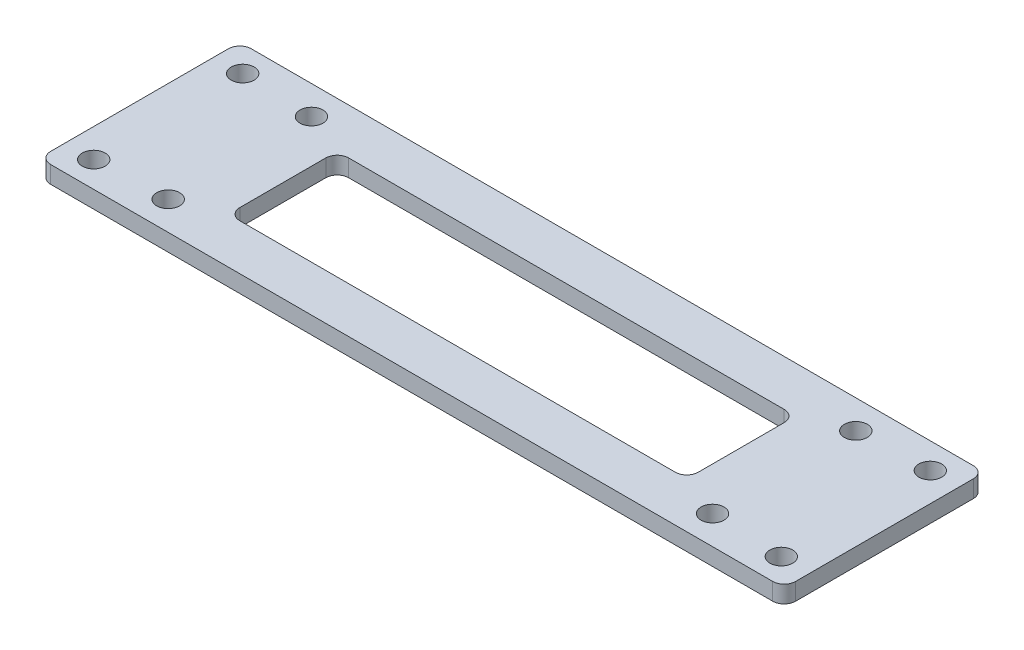
ISO-10303-21;
HEADER;
FILE_DESCRIPTION(('STEP AP214'),'2;1');
FILE_NAME('part.step','',(''),(''),'','','');
FILE_SCHEMA(('AUTOMOTIVE_DESIGN { 1 0 10303 214 1 1 1 1 }'));
ENDSEC;
DATA;
#1=APPLICATION_CONTEXT('core data for automotive mechanical design processes');
#2=APPLICATION_PROTOCOL_DEFINITION('international standard','automotive_design',2000,#1);
#3=PRODUCT_CONTEXT('',#1,'mechanical');
#4=PRODUCT('Part','Part','',(#3));
#5=PRODUCT_RELATED_PRODUCT_CATEGORY('part','',(#4));
#6=PRODUCT_DEFINITION_FORMATION('','',#4);
#7=PRODUCT_DEFINITION_CONTEXT('part definition',#1,'design');
#8=PRODUCT_DEFINITION('design','',#6,#7);
#9=PRODUCT_DEFINITION_SHAPE('','',#8);
#10=(LENGTH_UNIT() NAMED_UNIT(*) SI_UNIT(.MILLI.,.METRE.));
#11=(NAMED_UNIT(*) PLANE_ANGLE_UNIT() SI_UNIT($,.RADIAN.));
#12=(NAMED_UNIT(*) SI_UNIT($,.STERADIAN.) SOLID_ANGLE_UNIT());
#13=UNCERTAINTY_MEASURE_WITH_UNIT(LENGTH_MEASURE(1.E-05),#10,'distance_accuracy_value','');
#14=(GEOMETRIC_REPRESENTATION_CONTEXT(3) GLOBAL_UNCERTAINTY_ASSIGNED_CONTEXT((#13)) GLOBAL_UNIT_ASSIGNED_CONTEXT((#10,
#11,#12)) REPRESENTATION_CONTEXT('',''));
#15=CARTESIAN_POINT('',(0.,0.,0.));
#16=DIRECTION('',(0.,0.,1.));
#17=DIRECTION('',(1.,0.,0.));
#18=AXIS2_PLACEMENT_3D('',#15,#16,#17);
#19=CARTESIAN_POINT('',(0.,3.,0.));
#20=DIRECTION('',(0.,1.,0.));
#21=DIRECTION('',(0.,0.,1.));
#22=AXIS2_PLACEMENT_3D('',#19,#20,#21);
#23=PLANE('',#22);
#24=DIRECTION('',(0.,0.,-1.));
#25=VECTOR('',#24,1.);
#26=CARTESIAN_POINT('',(40.,3.,-9.5));
#27=LINE('',#26,#25);
#28=CARTESIAN_POINT('',(40.,3.,7.5));
#29=VERTEX_POINT('',#28);
#30=CARTESIAN_POINT('',(40.,3.,-7.5));
#31=VERTEX_POINT('',#30);
#32=EDGE_CURVE('E242',#29,#31,#27,.T.);
#33=ORIENTED_EDGE('',*,*,#32,.F.);
#34=CARTESIAN_POINT('',(38.,3.,7.5));
#35=DIRECTION('',(0.,1.,0.));
#36=DIRECTION('',(0.,0.,1.));
#37=AXIS2_PLACEMENT_3D('',#34,#35,#36);
#38=CIRCLE('',#37,2.);
#39=CARTESIAN_POINT('',(38.,3.,9.5));
#40=VERTEX_POINT('',#39);
#41=EDGE_CURVE('E222',#29,#40,#38,.F.);
#42=ORIENTED_EDGE('',*,*,#41,.T.);
#43=DIRECTION('',(1.,0.,0.));
#44=VECTOR('',#43,1.);
#45=CARTESIAN_POINT('',(-40.,3.,9.5));
#46=LINE('',#45,#44);
#47=CARTESIAN_POINT('',(-38.,3.,9.5));
#48=VERTEX_POINT('',#47);
#49=EDGE_CURVE('E266',#48,#40,#46,.T.);
#50=ORIENTED_EDGE('',*,*,#49,.F.);
#51=CARTESIAN_POINT('',(-38.,3.,7.5));
#52=DIRECTION('',(0.,1.,0.));
#53=DIRECTION('',(0.,0.,1.));
#54=AXIS2_PLACEMENT_3D('',#51,#52,#53);
#55=CIRCLE('',#54,2.);
#56=CARTESIAN_POINT('',(-40.,3.,7.5));
#57=VERTEX_POINT('',#56);
#58=EDGE_CURVE('E214',#48,#57,#55,.F.);
#59=ORIENTED_EDGE('',*,*,#58,.T.);
#60=DIRECTION('',(0.,0.,1.));
#61=VECTOR('',#60,1.);
#62=CARTESIAN_POINT('',(-40.,3.,-9.5));
#63=LINE('',#62,#61);
#64=CARTESIAN_POINT('',(-40.,3.,-7.5));
#65=VERTEX_POINT('',#64);
#66=EDGE_CURVE('E233',#65,#57,#63,.T.);
#67=ORIENTED_EDGE('',*,*,#66,.F.);
#68=CARTESIAN_POINT('',(-38.,3.,-7.5));
#69=DIRECTION('',(0.,1.,0.));
#70=DIRECTION('',(0.,0.,1.));
#71=AXIS2_PLACEMENT_3D('',#68,#69,#70);
#72=CIRCLE('',#71,2.);
#73=CARTESIAN_POINT('',(-38.,3.,-9.5));
#74=VERTEX_POINT('',#73);
#75=EDGE_CURVE('E43',#65,#74,#72,.F.);
#76=ORIENTED_EDGE('',*,*,#75,.T.);
#77=DIRECTION('',(-1.,0.,0.));
#78=VECTOR('',#77,1.);
#79=CARTESIAN_POINT('',(-40.,3.,-9.5));
#80=LINE('',#79,#78);
#81=CARTESIAN_POINT('',(38.,3.,-9.5));
#82=VERTEX_POINT('',#81);
#83=EDGE_CURVE('E231',#82,#74,#80,.T.);
#84=ORIENTED_EDGE('',*,*,#83,.F.);
#85=CARTESIAN_POINT('',(38.,3.,-7.5));
#86=DIRECTION('',(0.,1.,0.));
#87=DIRECTION('',(0.,0.,1.));
#88=AXIS2_PLACEMENT_3D('',#85,#86,#87);
#89=CIRCLE('',#88,2.);
#90=EDGE_CURVE('E218',#82,#31,#89,.F.);
#91=ORIENTED_EDGE('',*,*,#90,.T.);
#92=EDGE_LOOP('',(#33,#42,#50,#59,#67,#76,#84,#91));
#93=FACE_BOUND('',#92,.T.);
#94=CARTESIAN_POINT('',(47.5,3.,12.5));
#95=DIRECTION('',(0.,1.,0.));
#96=DIRECTION('',(0.,0.,-1.));
#97=AXIS2_PLACEMENT_3D('',#94,#95,#96);
#98=CIRCLE('',#97,2.);
#99=CARTESIAN_POINT('',(47.5,3.,10.5));
#100=VERTEX_POINT('',#99);
#101=EDGE_CURVE('E310',#100,#100,#98,.T.);
#102=ORIENTED_EDGE('',*,*,#101,.F.);
#103=EDGE_LOOP('',(#102));
#104=FACE_BOUND('',#103,.T.);
#105=CARTESIAN_POINT('',(-47.5,3.,-12.5));
#106=DIRECTION('',(0.,1.,0.));
#107=DIRECTION('',(0.,0.,1.));
#108=AXIS2_PLACEMENT_3D('',#105,#106,#107);
#109=CIRCLE('',#108,2.);
#110=CARTESIAN_POINT('',(-47.5,3.,-10.5));
#111=VERTEX_POINT('',#110);
#112=EDGE_CURVE('E171',#111,#111,#109,.T.);
#113=ORIENTED_EDGE('',*,*,#112,.F.);
#114=EDGE_LOOP('',(#113));
#115=FACE_BOUND('',#114,.T.);
#116=DIRECTION('',(-1.,0.,0.));
#117=VECTOR('',#116,1.);
#118=CARTESIAN_POINT('',(-55.,3.,-17.5));
#119=LINE('',#118,#117);
#120=CARTESIAN_POINT('',(63.,3.,-17.5));
#121=VERTEX_POINT('',#120);
#122=CARTESIAN_POINT('',(-63.,3.,-17.5));
#123=VERTEX_POINT('',#122);
#124=EDGE_CURVE('E157',#121,#123,#119,.T.);
#125=ORIENTED_EDGE('',*,*,#124,.T.);
#126=CARTESIAN_POINT('',(-63.,3.,-15.5));
#127=DIRECTION('',(0.,1.,0.));
#128=DIRECTION('',(0.,0.,1.));
#129=AXIS2_PLACEMENT_3D('',#126,#127,#128);
#130=CIRCLE('',#129,2.);
#131=CARTESIAN_POINT('',(-65.,3.,-15.5));
#132=VERTEX_POINT('',#131);
#133=EDGE_CURVE('E337',#123,#132,#130,.T.);
#134=ORIENTED_EDGE('',*,*,#133,.T.);
#135=DIRECTION('',(0.,0.,1.));
#136=VECTOR('',#135,1.);
#137=CARTESIAN_POINT('',(-65.,3.,17.5));
#138=LINE('',#137,#136);
#139=CARTESIAN_POINT('',(-65.,3.,15.5));
#140=VERTEX_POINT('',#139);
#141=EDGE_CURVE('E295',#132,#140,#138,.T.);
#142=ORIENTED_EDGE('',*,*,#141,.T.);
#143=CARTESIAN_POINT('',(-63.,3.,15.5));
#144=DIRECTION('',(0.,1.,0.));
#145=DIRECTION('',(0.,0.,1.));
#146=AXIS2_PLACEMENT_3D('',#143,#144,#145);
#147=CIRCLE('',#146,2.);
#148=CARTESIAN_POINT('',(-63.,3.,17.5));
#149=VERTEX_POINT('',#148);
#150=EDGE_CURVE('E335',#140,#149,#147,.T.);
#151=ORIENTED_EDGE('',*,*,#150,.T.);
#152=DIRECTION('',(1.,0.,0.));
#153=VECTOR('',#152,1.);
#154=CARTESIAN_POINT('',(-55.,3.,17.5));
#155=LINE('',#154,#153);
#156=CARTESIAN_POINT('',(63.,3.,17.5));
#157=VERTEX_POINT('',#156);
#158=EDGE_CURVE('E161',#149,#157,#155,.T.);
#159=ORIENTED_EDGE('',*,*,#158,.T.);
#160=CARTESIAN_POINT('',(63.,3.,15.5));
#161=DIRECTION('',(0.,1.,0.));
#162=DIRECTION('',(0.,0.,1.));
#163=AXIS2_PLACEMENT_3D('',#160,#161,#162);
#164=CIRCLE('',#163,2.);
#165=CARTESIAN_POINT('',(65.,3.,15.5));
#166=VERTEX_POINT('',#165);
#167=EDGE_CURVE('E333',#157,#166,#164,.T.);
#168=ORIENTED_EDGE('',*,*,#167,.T.);
#169=DIRECTION('',(0.,0.,-1.));
#170=VECTOR('',#169,1.);
#171=CARTESIAN_POINT('',(65.,3.,17.5));
#172=LINE('',#171,#170);
#173=CARTESIAN_POINT('',(65.,3.,-15.5));
#174=VERTEX_POINT('',#173);
#175=EDGE_CURVE('E278',#166,#174,#172,.T.);
#176=ORIENTED_EDGE('',*,*,#175,.T.);
#177=CARTESIAN_POINT('',(63.,3.,-15.5));
#178=DIRECTION('',(0.,1.,0.));
#179=DIRECTION('',(0.,0.,1.));
#180=AXIS2_PLACEMENT_3D('',#177,#178,#179);
#181=CIRCLE('',#180,2.);
#182=EDGE_CURVE('E331',#174,#121,#181,.T.);
#183=ORIENTED_EDGE('',*,*,#182,.T.);
#184=EDGE_LOOP('',(#125,#134,#142,#151,#159,#168,#176,#183));
#185=FACE_BOUND('',#184,.T.);
#186=CARTESIAN_POINT('',(-47.5,3.,12.5));
#187=DIRECTION('',(0.,1.,0.));
#188=DIRECTION('',(0.,0.,1.));
#189=AXIS2_PLACEMENT_3D('',#186,#187,#188);
#190=CIRCLE('',#189,2.);
#191=CARTESIAN_POINT('',(-47.5,3.,14.5));
#192=VERTEX_POINT('',#191);
#193=EDGE_CURVE('E316',#192,#192,#190,.T.);
#194=ORIENTED_EDGE('',*,*,#193,.F.);
#195=EDGE_LOOP('',(#194));
#196=FACE_BOUND('',#195,.T.);
#197=CARTESIAN_POINT('',(47.5,3.,-12.5));
#198=DIRECTION('',(0.,1.,0.));
#199=DIRECTION('',(0.,0.,-1.));
#200=AXIS2_PLACEMENT_3D('',#197,#198,#199);
#201=CIRCLE('',#200,2.);
#202=CARTESIAN_POINT('',(47.5,3.,-14.5));
#203=VERTEX_POINT('',#202);
#204=EDGE_CURVE('E304',#203,#203,#201,.T.);
#205=ORIENTED_EDGE('',*,*,#204,.F.);
#206=EDGE_LOOP('',(#205));
#207=FACE_BOUND('',#206,.T.);
#208=CARTESIAN_POINT('',(-59.9999999999997,3.,13.));
#209=DIRECTION('',(0.,1.,0.));
#210=DIRECTION('',(0.,0.,1.));
#211=AXIS2_PLACEMENT_3D('',#208,#209,#210);
#212=CIRCLE('',#211,2.);
#213=CARTESIAN_POINT('',(-59.9999999999997,3.,15.));
#214=VERTEX_POINT('',#213);
#215=EDGE_CURVE('E283',#214,#214,#212,.T.);
#216=ORIENTED_EDGE('',*,*,#215,.F.);
#217=EDGE_LOOP('',(#216));
#218=FACE_BOUND('',#217,.T.);
#219=CARTESIAN_POINT('',(-60.,3.,-13.));
#220=DIRECTION('',(0.,1.,0.));
#221=DIRECTION('',(0.,0.,1.));
#222=AXIS2_PLACEMENT_3D('',#219,#220,#221);
#223=CIRCLE('',#222,2.);
#224=CARTESIAN_POINT('',(-60.,3.,-11.));
#225=VERTEX_POINT('',#224);
#226=EDGE_CURVE('E289',#225,#225,#223,.T.);
#227=ORIENTED_EDGE('',*,*,#226,.F.);
#228=EDGE_LOOP('',(#227));
#229=FACE_BOUND('',#228,.T.);
#230=CARTESIAN_POINT('',(60.,3.,13.));
#231=DIRECTION('',(0.,1.,0.));
#232=DIRECTION('',(0.,0.,1.));
#233=AXIS2_PLACEMENT_3D('',#230,#231,#232);
#234=CIRCLE('',#233,2.);
#235=CARTESIAN_POINT('',(60.,3.,15.));
#236=VERTEX_POINT('',#235);
#237=EDGE_CURVE('E257',#236,#236,#234,.T.);
#238=ORIENTED_EDGE('',*,*,#237,.F.);
#239=EDGE_LOOP('',(#238));
#240=FACE_BOUND('',#239,.T.);
#241=CARTESIAN_POINT('',(60.,3.,-13.));
#242=DIRECTION('',(0.,1.,0.));
#243=DIRECTION('',(0.,0.,1.));
#244=AXIS2_PLACEMENT_3D('',#241,#242,#243);
#245=CIRCLE('',#244,2.);
#246=CARTESIAN_POINT('',(60.,3.,-11.));
#247=VERTEX_POINT('',#246);
#248=EDGE_CURVE('E272',#247,#247,#245,.T.);
#249=ORIENTED_EDGE('',*,*,#248,.F.);
#250=EDGE_LOOP('',(#249));
#251=FACE_BOUND('',#250,.T.);
#252=ADVANCED_FACE('F35',(#93,#104,#115,#185,#196,#207,#218,#229,#240,#251),#23,.T.);
#253=CARTESIAN_POINT('',(0.,0.,0.));
#254=DIRECTION('',(0.,1.,0.));
#255=DIRECTION('',(0.,0.,1.));
#256=AXIS2_PLACEMENT_3D('',#253,#254,#255);
#257=PLANE('',#256);
#258=DIRECTION('',(0.,0.,1.));
#259=VECTOR('',#258,1.);
#260=CARTESIAN_POINT('',(-40.,0.,-9.5));
#261=LINE('',#260,#259);
#262=CARTESIAN_POINT('',(-40.,0.,-7.5));
#263=VERTEX_POINT('',#262);
#264=CARTESIAN_POINT('',(-40.,0.,7.5));
#265=VERTEX_POINT('',#264);
#266=EDGE_CURVE('E248',#263,#265,#261,.T.);
#267=ORIENTED_EDGE('',*,*,#266,.T.);
#268=CARTESIAN_POINT('',(-38.,0.,7.5));
#269=DIRECTION('',(0.,1.,0.));
#270=DIRECTION('',(0.,0.,1.));
#271=AXIS2_PLACEMENT_3D('',#268,#269,#270);
#272=CIRCLE('',#271,2.);
#273=CARTESIAN_POINT('',(-38.,0.,9.5));
#274=VERTEX_POINT('',#273);
#275=EDGE_CURVE('E216',#265,#274,#272,.T.);
#276=ORIENTED_EDGE('',*,*,#275,.T.);
#277=DIRECTION('',(1.,0.,0.));
#278=VECTOR('',#277,1.);
#279=CARTESIAN_POINT('',(-40.,0.,9.5));
#280=LINE('',#279,#278);
#281=CARTESIAN_POINT('',(38.,0.,9.5));
#282=VERTEX_POINT('',#281);
#283=EDGE_CURVE('E254',#274,#282,#280,.T.);
#284=ORIENTED_EDGE('',*,*,#283,.T.);
#285=CARTESIAN_POINT('',(38.,0.,7.5));
#286=DIRECTION('',(0.,1.,0.));
#287=DIRECTION('',(0.,0.,1.));
#288=AXIS2_PLACEMENT_3D('',#285,#286,#287);
#289=CIRCLE('',#288,2.);
#290=CARTESIAN_POINT('',(40.,0.,7.5));
#291=VERTEX_POINT('',#290);
#292=EDGE_CURVE('E224',#282,#291,#289,.T.);
#293=ORIENTED_EDGE('',*,*,#292,.T.);
#294=DIRECTION('',(0.,0.,-1.));
#295=VECTOR('',#294,1.);
#296=CARTESIAN_POINT('',(40.,0.,-9.5));
#297=LINE('',#296,#295);
#298=CARTESIAN_POINT('',(40.,0.,-7.5));
#299=VERTEX_POINT('',#298);
#300=EDGE_CURVE('E259',#291,#299,#297,.T.);
#301=ORIENTED_EDGE('',*,*,#300,.T.);
#302=CARTESIAN_POINT('',(38.,0.,-7.5));
#303=DIRECTION('',(0.,1.,0.));
#304=DIRECTION('',(0.,0.,1.));
#305=AXIS2_PLACEMENT_3D('',#302,#303,#304);
#306=CIRCLE('',#305,2.);
#307=CARTESIAN_POINT('',(38.,0.,-9.5));
#308=VERTEX_POINT('',#307);
#309=EDGE_CURVE('E220',#299,#308,#306,.T.);
#310=ORIENTED_EDGE('',*,*,#309,.T.);
#311=DIRECTION('',(-1.,0.,0.));
#312=VECTOR('',#311,1.);
#313=CARTESIAN_POINT('',(-40.,0.,-9.5));
#314=LINE('',#313,#312);
#315=CARTESIAN_POINT('',(-38.,0.,-9.5));
#316=VERTEX_POINT('',#315);
#317=EDGE_CURVE('E250',#308,#316,#314,.T.);
#318=ORIENTED_EDGE('',*,*,#317,.T.);
#319=CARTESIAN_POINT('',(-38.,0.,-7.5));
#320=DIRECTION('',(0.,1.,0.));
#321=DIRECTION('',(0.,0.,1.));
#322=AXIS2_PLACEMENT_3D('',#319,#320,#321);
#323=CIRCLE('',#322,2.);
#324=EDGE_CURVE('E11',#316,#263,#323,.T.);
#325=ORIENTED_EDGE('',*,*,#324,.T.);
#326=EDGE_LOOP('',(#267,#276,#284,#293,#301,#310,#318,#325));
#327=FACE_BOUND('',#326,.T.);
#328=DIRECTION('',(0.,0.,1.));
#329=VECTOR('',#328,1.);
#330=CARTESIAN_POINT('',(-65.,0.,17.5));
#331=LINE('',#330,#329);
#332=CARTESIAN_POINT('',(-65.,0.,-15.5));
#333=VERTEX_POINT('',#332);
#334=CARTESIAN_POINT('',(-65.,0.,15.5));
#335=VERTEX_POINT('',#334);
#336=EDGE_CURVE('E298',#333,#335,#331,.T.);
#337=ORIENTED_EDGE('',*,*,#336,.F.);
#338=CARTESIAN_POINT('',(-63.,0.,-15.5));
#339=DIRECTION('',(0.,1.,0.));
#340=DIRECTION('',(0.,0.,1.));
#341=AXIS2_PLACEMENT_3D('',#338,#339,#340);
#342=CIRCLE('',#341,2.);
#343=CARTESIAN_POINT('',(-63.,0.,-17.5));
#344=VERTEX_POINT('',#343);
#345=EDGE_CURVE('E169',#333,#344,#342,.F.);
#346=ORIENTED_EDGE('',*,*,#345,.T.);
#347=DIRECTION('',(-1.,0.,0.));
#348=VECTOR('',#347,1.);
#349=CARTESIAN_POINT('',(-55.,0.,-17.5));
#350=LINE('',#349,#348);
#351=CARTESIAN_POINT('',(63.,0.,-17.5));
#352=VERTEX_POINT('',#351);
#353=EDGE_CURVE('E154',#352,#344,#350,.T.);
#354=ORIENTED_EDGE('',*,*,#353,.F.);
#355=CARTESIAN_POINT('',(63.,0.,-15.5));
#356=DIRECTION('',(0.,1.,0.));
#357=DIRECTION('',(0.,0.,1.));
#358=AXIS2_PLACEMENT_3D('',#355,#356,#357);
#359=CIRCLE('',#358,2.);
#360=CARTESIAN_POINT('',(65.,0.,-15.5));
#361=VERTEX_POINT('',#360);
#362=EDGE_CURVE('E166',#352,#361,#359,.F.);
#363=ORIENTED_EDGE('',*,*,#362,.T.);
#364=DIRECTION('',(0.,0.,-1.));
#365=VECTOR('',#364,1.);
#366=CARTESIAN_POINT('',(65.,0.,17.5));
#367=LINE('',#366,#365);
#368=CARTESIAN_POINT('',(65.,0.,15.5));
#369=VERTEX_POINT('',#368);
#370=EDGE_CURVE('E281',#369,#361,#367,.T.);
#371=ORIENTED_EDGE('',*,*,#370,.F.);
#372=CARTESIAN_POINT('',(63.,0.,15.5));
#373=DIRECTION('',(0.,1.,0.));
#374=DIRECTION('',(0.,0.,1.));
#375=AXIS2_PLACEMENT_3D('',#372,#373,#374);
#376=CIRCLE('',#375,2.);
#377=CARTESIAN_POINT('',(63.,0.,17.5));
#378=VERTEX_POINT('',#377);
#379=EDGE_CURVE('E50',#369,#378,#376,.F.);
#380=ORIENTED_EDGE('',*,*,#379,.T.);
#381=DIRECTION('',(1.,0.,0.));
#382=VECTOR('',#381,1.);
#383=CARTESIAN_POINT('',(-55.,0.,17.5));
#384=LINE('',#383,#382);
#385=CARTESIAN_POINT('',(-63.,0.,17.5));
#386=VERTEX_POINT('',#385);
#387=EDGE_CURVE('E170',#386,#378,#384,.T.);
#388=ORIENTED_EDGE('',*,*,#387,.F.);
#389=CARTESIAN_POINT('',(-63.,0.,15.5));
#390=DIRECTION('',(0.,1.,0.));
#391=DIRECTION('',(0.,0.,1.));
#392=AXIS2_PLACEMENT_3D('',#389,#390,#391);
#393=CIRCLE('',#392,2.);
#394=EDGE_CURVE('E179',#386,#335,#393,.F.);
#395=ORIENTED_EDGE('',*,*,#394,.T.);
#396=EDGE_LOOP('',(#337,#346,#354,#363,#371,#380,#388,#395));
#397=FACE_BOUND('',#396,.T.);
#398=CARTESIAN_POINT('',(-47.5,0.,-12.5));
#399=DIRECTION('',(0.,1.,0.));
#400=DIRECTION('',(0.,0.,1.));
#401=AXIS2_PLACEMENT_3D('',#398,#399,#400);
#402=CIRCLE('',#401,2.);
#403=CARTESIAN_POINT('',(-47.5,0.,-10.5));
#404=VERTEX_POINT('',#403);
#405=EDGE_CURVE('E319',#404,#404,#402,.T.);
#406=ORIENTED_EDGE('',*,*,#405,.T.);
#407=EDGE_LOOP('',(#406));
#408=FACE_BOUND('',#407,.T.);
#409=CARTESIAN_POINT('',(-47.5,0.,12.5));
#410=DIRECTION('',(0.,1.,0.));
#411=DIRECTION('',(0.,0.,1.));
#412=AXIS2_PLACEMENT_3D('',#409,#410,#411);
#413=CIRCLE('',#412,2.);
#414=CARTESIAN_POINT('',(-47.5,0.,14.5));
#415=VERTEX_POINT('',#414);
#416=EDGE_CURVE('E313',#415,#415,#413,.T.);
#417=ORIENTED_EDGE('',*,*,#416,.T.);
#418=EDGE_LOOP('',(#417));
#419=FACE_BOUND('',#418,.T.);
#420=CARTESIAN_POINT('',(47.5,0.,12.5));
#421=DIRECTION('',(0.,1.,0.));
#422=DIRECTION('',(0.,0.,-1.));
#423=AXIS2_PLACEMENT_3D('',#420,#421,#422);
#424=CIRCLE('',#423,2.);
#425=CARTESIAN_POINT('',(47.5,0.,10.5));
#426=VERTEX_POINT('',#425);
#427=EDGE_CURVE('E307',#426,#426,#424,.T.);
#428=ORIENTED_EDGE('',*,*,#427,.T.);
#429=EDGE_LOOP('',(#428));
#430=FACE_BOUND('',#429,.T.);
#431=CARTESIAN_POINT('',(47.5,0.,-12.5));
#432=DIRECTION('',(0.,1.,0.));
#433=DIRECTION('',(0.,0.,-1.));
#434=AXIS2_PLACEMENT_3D('',#431,#432,#433);
#435=CIRCLE('',#434,2.);
#436=CARTESIAN_POINT('',(47.5,0.,-14.5));
#437=VERTEX_POINT('',#436);
#438=EDGE_CURVE('E301',#437,#437,#435,.T.);
#439=ORIENTED_EDGE('',*,*,#438,.T.);
#440=EDGE_LOOP('',(#439));
#441=FACE_BOUND('',#440,.T.);
#442=CARTESIAN_POINT('',(-59.9999999999997,0.,13.));
#443=DIRECTION('',(0.,1.,0.));
#444=DIRECTION('',(0.,0.,1.));
#445=AXIS2_PLACEMENT_3D('',#442,#443,#444);
#446=CIRCLE('',#445,2.);
#447=CARTESIAN_POINT('',(-59.9999999999997,0.,15.));
#448=VERTEX_POINT('',#447);
#449=EDGE_CURVE('E286',#448,#448,#446,.T.);
#450=ORIENTED_EDGE('',*,*,#449,.T.);
#451=EDGE_LOOP('',(#450));
#452=FACE_BOUND('',#451,.T.);
#453=CARTESIAN_POINT('',(-60.,0.,-13.));
#454=DIRECTION('',(0.,1.,0.));
#455=DIRECTION('',(0.,0.,1.));
#456=AXIS2_PLACEMENT_3D('',#453,#454,#455);
#457=CIRCLE('',#456,2.);
#458=CARTESIAN_POINT('',(-60.,0.,-11.));
#459=VERTEX_POINT('',#458);
#460=EDGE_CURVE('E292',#459,#459,#457,.T.);
#461=ORIENTED_EDGE('',*,*,#460,.T.);
#462=EDGE_LOOP('',(#461));
#463=FACE_BOUND('',#462,.T.);
#464=CARTESIAN_POINT('',(60.,0.,13.));
#465=DIRECTION('',(0.,1.,0.));
#466=DIRECTION('',(0.,0.,1.));
#467=AXIS2_PLACEMENT_3D('',#464,#465,#466);
#468=CIRCLE('',#467,2.);
#469=CARTESIAN_POINT('',(60.,0.,15.));
#470=VERTEX_POINT('',#469);
#471=EDGE_CURVE('E269',#470,#470,#468,.T.);
#472=ORIENTED_EDGE('',*,*,#471,.T.);
#473=EDGE_LOOP('',(#472));
#474=FACE_BOUND('',#473,.T.);
#475=CARTESIAN_POINT('',(60.,0.,-13.));
#476=DIRECTION('',(0.,1.,0.));
#477=DIRECTION('',(0.,0.,1.));
#478=AXIS2_PLACEMENT_3D('',#475,#476,#477);
#479=CIRCLE('',#478,2.);
#480=CARTESIAN_POINT('',(60.,0.,-11.));
#481=VERTEX_POINT('',#480);
#482=EDGE_CURVE('E275',#481,#481,#479,.T.);
#483=ORIENTED_EDGE('',*,*,#482,.T.);
#484=EDGE_LOOP('',(#483));
#485=FACE_BOUND('',#484,.T.);
#486=ADVANCED_FACE('F164',(#327,#397,#408,#419,#430,#441,#452,#463,#474,#485),#257,.F.);
#487=CARTESIAN_POINT('',(-55.,3.,-17.5));
#488=DIRECTION('',(0.,0.,1.));
#489=DIRECTION('',(1.,0.,0.));
#490=AXIS2_PLACEMENT_3D('',#487,#488,#489);
#491=PLANE('',#490);
#492=ORIENTED_EDGE('',*,*,#353,.T.);
#493=DIRECTION('',(0.,1.,0.));
#494=VECTOR('',#493,1.);
#495=CARTESIAN_POINT('',(-63.,3.,-17.5));
#496=LINE('',#495,#494);
#497=EDGE_CURVE('E160',#344,#123,#496,.T.);
#498=ORIENTED_EDGE('',*,*,#497,.T.);
#499=ORIENTED_EDGE('',*,*,#124,.F.);
#500=DIRECTION('',(0.,1.,0.));
#501=VECTOR('',#500,1.);
#502=CARTESIAN_POINT('',(63.,0.,-17.5));
#503=LINE('',#502,#501);
#504=EDGE_CURVE('E150',#121,#352,#503,.F.);
#505=ORIENTED_EDGE('',*,*,#504,.T.);
#506=EDGE_LOOP('',(#492,#498,#499,#505));
#507=FACE_BOUND('',#506,.T.);
#508=ADVANCED_FACE('F152',(#507),#491,.F.);
#509=CARTESIAN_POINT('',(-55.,3.,17.5));
#510=DIRECTION('',(0.,0.,-1.));
#511=DIRECTION('',(-1.,0.,0.));
#512=AXIS2_PLACEMENT_3D('',#509,#510,#511);
#513=PLANE('',#512);
#514=ORIENTED_EDGE('',*,*,#158,.F.);
#515=DIRECTION('',(0.,1.,0.));
#516=VECTOR('',#515,1.);
#517=CARTESIAN_POINT('',(-63.,0.,17.5));
#518=LINE('',#517,#516);
#519=EDGE_CURVE('E57',#149,#386,#518,.F.);
#520=ORIENTED_EDGE('',*,*,#519,.T.);
#521=ORIENTED_EDGE('',*,*,#387,.T.);
#522=DIRECTION('',(0.,1.,0.));
#523=VECTOR('',#522,1.);
#524=CARTESIAN_POINT('',(63.,3.,17.5));
#525=LINE('',#524,#523);
#526=EDGE_CURVE('E187',#378,#157,#525,.T.);
#527=ORIENTED_EDGE('',*,*,#526,.T.);
#528=EDGE_LOOP('',(#514,#520,#521,#527));
#529=FACE_BOUND('',#528,.T.);
#530=ADVANCED_FACE('F371',(#529),#513,.F.);
#531=CARTESIAN_POINT('',(-47.5,3.,-12.5));
#532=DIRECTION('',(0.,-1.,0.));
#533=DIRECTION('',(0.,0.,-1.));
#534=AXIS2_PLACEMENT_3D('',#531,#532,#533);
#535=CYLINDRICAL_SURFACE('',#534,2.);
#536=ORIENTED_EDGE('',*,*,#112,.T.);
#537=EDGE_LOOP('',(#536));
#538=FACE_BOUND('',#537,.T.);
#539=ORIENTED_EDGE('',*,*,#405,.F.);
#540=EDGE_LOOP('',(#539));
#541=FACE_BOUND('',#540,.T.);
#542=ADVANCED_FACE('F368',(#538,#541),#535,.F.);
#543=CARTESIAN_POINT('',(-47.5,3.,12.5));
#544=DIRECTION('',(0.,-1.,0.));
#545=DIRECTION('',(0.,0.,-1.));
#546=AXIS2_PLACEMENT_3D('',#543,#544,#545);
#547=CYLINDRICAL_SURFACE('',#546,2.);
#548=ORIENTED_EDGE('',*,*,#193,.T.);
#549=EDGE_LOOP('',(#548));
#550=FACE_BOUND('',#549,.T.);
#551=ORIENTED_EDGE('',*,*,#416,.F.);
#552=EDGE_LOOP('',(#551));
#553=FACE_BOUND('',#552,.T.);
#554=ADVANCED_FACE('F390',(#550,#553),#547,.F.);
#555=CARTESIAN_POINT('',(47.5,3.,12.5));
#556=DIRECTION('',(0.,-1.,0.));
#557=DIRECTION('',(0.,0.,-1.));
#558=AXIS2_PLACEMENT_3D('',#555,#556,#557);
#559=CYLINDRICAL_SURFACE('',#558,2.);
#560=ORIENTED_EDGE('',*,*,#101,.T.);
#561=EDGE_LOOP('',(#560));
#562=FACE_BOUND('',#561,.T.);
#563=ORIENTED_EDGE('',*,*,#427,.F.);
#564=EDGE_LOOP('',(#563));
#565=FACE_BOUND('',#564,.T.);
#566=ADVANCED_FACE('F397',(#562,#565),#559,.F.);
#567=CARTESIAN_POINT('',(47.5,3.,-12.5));
#568=DIRECTION('',(0.,-1.,0.));
#569=DIRECTION('',(0.,0.,-1.));
#570=AXIS2_PLACEMENT_3D('',#567,#568,#569);
#571=CYLINDRICAL_SURFACE('',#570,2.);
#572=ORIENTED_EDGE('',*,*,#204,.T.);
#573=EDGE_LOOP('',(#572));
#574=FACE_BOUND('',#573,.T.);
#575=ORIENTED_EDGE('',*,*,#438,.F.);
#576=EDGE_LOOP('',(#575));
#577=FACE_BOUND('',#576,.T.);
#578=ADVANCED_FACE('F404',(#574,#577),#571,.F.);
#579=CARTESIAN_POINT('',(-65.,0.,17.5));
#580=DIRECTION('',(-1.,0.,0.));
#581=DIRECTION('',(0.,0.,1.));
#582=AXIS2_PLACEMENT_3D('',#579,#580,#581);
#583=PLANE('',#582);
#584=ORIENTED_EDGE('',*,*,#141,.F.);
#585=DIRECTION('',(0.,1.,0.));
#586=VECTOR('',#585,1.);
#587=CARTESIAN_POINT('',(-65.,0.,-15.5));
#588=LINE('',#587,#586);
#589=EDGE_CURVE('E177',#132,#333,#588,.F.);
#590=ORIENTED_EDGE('',*,*,#589,.T.);
#591=ORIENTED_EDGE('',*,*,#336,.T.);
#592=DIRECTION('',(0.,1.,0.));
#593=VECTOR('',#592,1.);
#594=CARTESIAN_POINT('',(-65.,3.,15.5));
#595=LINE('',#594,#593);
#596=EDGE_CURVE('E181',#335,#140,#595,.T.);
#597=ORIENTED_EDGE('',*,*,#596,.T.);
#598=EDGE_LOOP('',(#584,#590,#591,#597));
#599=FACE_BOUND('',#598,.T.);
#600=ADVANCED_FACE('F342',(#599),#583,.T.);
#601=CARTESIAN_POINT('',(-60.,0.,-13.));
#602=DIRECTION('',(0.,1.,0.));
#603=DIRECTION('',(0.,0.,1.));
#604=AXIS2_PLACEMENT_3D('',#601,#602,#603);
#605=CYLINDRICAL_SURFACE('',#604,2.);
#606=ORIENTED_EDGE('',*,*,#460,.F.);
#607=EDGE_LOOP('',(#606));
#608=FACE_BOUND('',#607,.T.);
#609=ORIENTED_EDGE('',*,*,#226,.T.);
#610=EDGE_LOOP('',(#609));
#611=FACE_BOUND('',#610,.T.);
#612=ADVANCED_FACE('F419',(#608,#611),#605,.F.);
#613=CARTESIAN_POINT('',(-59.9999999999997,0.,13.));
#614=DIRECTION('',(0.,1.,0.));
#615=DIRECTION('',(0.,0.,1.));
#616=AXIS2_PLACEMENT_3D('',#613,#614,#615);
#617=CYLINDRICAL_SURFACE('',#616,2.);
#618=ORIENTED_EDGE('',*,*,#449,.F.);
#619=EDGE_LOOP('',(#618));
#620=FACE_BOUND('',#619,.T.);
#621=ORIENTED_EDGE('',*,*,#215,.T.);
#622=EDGE_LOOP('',(#621));
#623=FACE_BOUND('',#622,.T.);
#624=ADVANCED_FACE('F426',(#620,#623),#617,.F.);
#625=CARTESIAN_POINT('',(65.,0.,17.5));
#626=DIRECTION('',(1.,0.,0.));
#627=DIRECTION('',(0.,0.,-1.));
#628=AXIS2_PLACEMENT_3D('',#625,#626,#627);
#629=PLANE('',#628);
#630=ORIENTED_EDGE('',*,*,#175,.F.);
#631=DIRECTION('',(0.,1.,0.));
#632=VECTOR('',#631,1.);
#633=CARTESIAN_POINT('',(65.,0.,15.5));
#634=LINE('',#633,#632);
#635=EDGE_CURVE('E192',#166,#369,#634,.F.);
#636=ORIENTED_EDGE('',*,*,#635,.T.);
#637=ORIENTED_EDGE('',*,*,#370,.T.);
#638=DIRECTION('',(0.,1.,0.));
#639=VECTOR('',#638,1.);
#640=CARTESIAN_POINT('',(65.,3.,-15.5));
#641=LINE('',#640,#639);
#642=EDGE_CURVE('E176',#361,#174,#641,.T.);
#643=ORIENTED_EDGE('',*,*,#642,.T.);
#644=EDGE_LOOP('',(#630,#636,#637,#643));
#645=FACE_BOUND('',#644,.T.);
#646=ADVANCED_FACE('F434',(#645),#629,.T.);
#647=CARTESIAN_POINT('',(60.,0.,-13.));
#648=DIRECTION('',(0.,1.,0.));
#649=DIRECTION('',(0.,0.,1.));
#650=AXIS2_PLACEMENT_3D('',#647,#648,#649);
#651=CYLINDRICAL_SURFACE('',#650,2.);
#652=ORIENTED_EDGE('',*,*,#482,.F.);
#653=EDGE_LOOP('',(#652));
#654=FACE_BOUND('',#653,.T.);
#655=ORIENTED_EDGE('',*,*,#248,.T.);
#656=EDGE_LOOP('',(#655));
#657=FACE_BOUND('',#656,.T.);
#658=ADVANCED_FACE('F442',(#654,#657),#651,.F.);
#659=CARTESIAN_POINT('',(60.,0.,13.));
#660=DIRECTION('',(0.,1.,0.));
#661=DIRECTION('',(0.,0.,1.));
#662=AXIS2_PLACEMENT_3D('',#659,#660,#661);
#663=CYLINDRICAL_SURFACE('',#662,2.);
#664=ORIENTED_EDGE('',*,*,#471,.F.);
#665=EDGE_LOOP('',(#664));
#666=FACE_BOUND('',#665,.T.);
#667=ORIENTED_EDGE('',*,*,#237,.T.);
#668=EDGE_LOOP('',(#667));
#669=FACE_BOUND('',#668,.T.);
#670=ADVANCED_FACE('F450',(#666,#669),#663,.F.);
#671=CARTESIAN_POINT('',(40.,0.,-9.5));
#672=DIRECTION('',(1.,0.,0.));
#673=DIRECTION('',(0.,0.,-1.));
#674=AXIS2_PLACEMENT_3D('',#671,#672,#673);
#675=PLANE('',#674);
#676=ORIENTED_EDGE('',*,*,#32,.T.);
#677=DIRECTION('',(0.,1.,0.));
#678=VECTOR('',#677,1.);
#679=CARTESIAN_POINT('',(40.,0.,-7.5));
#680=LINE('',#679,#678);
#681=EDGE_CURVE('E212',#31,#299,#680,.F.);
#682=ORIENTED_EDGE('',*,*,#681,.T.);
#683=ORIENTED_EDGE('',*,*,#300,.F.);
#684=DIRECTION('',(0.,1.,0.));
#685=VECTOR('',#684,1.);
#686=CARTESIAN_POINT('',(40.,3.,7.5));
#687=LINE('',#686,#685);
#688=EDGE_CURVE('E209',#291,#29,#687,.T.);
#689=ORIENTED_EDGE('',*,*,#688,.T.);
#690=EDGE_LOOP('',(#676,#682,#683,#689));
#691=FACE_BOUND('',#690,.T.);
#692=ADVANCED_FACE('F458',(#691),#675,.F.);
#693=CARTESIAN_POINT('',(-40.,0.,9.5));
#694=DIRECTION('',(0.,0.,1.));
#695=DIRECTION('',(1.,0.,0.));
#696=AXIS2_PLACEMENT_3D('',#693,#694,#695);
#697=PLANE('',#696);
#698=ORIENTED_EDGE('',*,*,#283,.F.);
#699=DIRECTION('',(0.,1.,0.));
#700=VECTOR('',#699,1.);
#701=CARTESIAN_POINT('',(-38.,3.,9.5));
#702=LINE('',#701,#700);
#703=EDGE_CURVE('E196',#274,#48,#702,.T.);
#704=ORIENTED_EDGE('',*,*,#703,.T.);
#705=ORIENTED_EDGE('',*,*,#49,.T.);
#706=DIRECTION('',(0.,1.,0.));
#707=VECTOR('',#706,1.);
#708=CARTESIAN_POINT('',(38.,0.,9.5));
#709=LINE('',#708,#707);
#710=EDGE_CURVE('E194',#40,#282,#709,.F.);
#711=ORIENTED_EDGE('',*,*,#710,.T.);
#712=EDGE_LOOP('',(#698,#704,#705,#711));
#713=FACE_BOUND('',#712,.T.);
#714=ADVANCED_FACE('F465',(#713),#697,.F.);
#715=CARTESIAN_POINT('',(-40.,0.,-9.5));
#716=DIRECTION('',(-1.,0.,0.));
#717=DIRECTION('',(0.,0.,1.));
#718=AXIS2_PLACEMENT_3D('',#715,#716,#717);
#719=PLANE('',#718);
#720=ORIENTED_EDGE('',*,*,#66,.T.);
#721=DIRECTION('',(0.,1.,0.));
#722=VECTOR('',#721,1.);
#723=CARTESIAN_POINT('',(-40.,0.,7.5));
#724=LINE('',#723,#722);
#725=EDGE_CURVE('E202',#57,#265,#724,.F.);
#726=ORIENTED_EDGE('',*,*,#725,.T.);
#727=ORIENTED_EDGE('',*,*,#266,.F.);
#728=DIRECTION('',(0.,1.,0.));
#729=VECTOR('',#728,1.);
#730=CARTESIAN_POINT('',(-40.,3.,-7.5));
#731=LINE('',#730,#729);
#732=EDGE_CURVE('E199',#263,#65,#731,.T.);
#733=ORIENTED_EDGE('',*,*,#732,.T.);
#734=EDGE_LOOP('',(#720,#726,#727,#733));
#735=FACE_BOUND('',#734,.T.);
#736=ADVANCED_FACE('F252',(#735),#719,.F.);
#737=CARTESIAN_POINT('',(-40.,0.,-9.5));
#738=DIRECTION('',(0.,0.,-1.));
#739=DIRECTION('',(-1.,0.,0.));
#740=AXIS2_PLACEMENT_3D('',#737,#738,#739);
#741=PLANE('',#740);
#742=ORIENTED_EDGE('',*,*,#317,.F.);
#743=DIRECTION('',(0.,1.,0.));
#744=VECTOR('',#743,1.);
#745=CARTESIAN_POINT('',(38.,3.,-9.5));
#746=LINE('',#745,#744);
#747=EDGE_CURVE('E206',#308,#82,#746,.T.);
#748=ORIENTED_EDGE('',*,*,#747,.T.);
#749=ORIENTED_EDGE('',*,*,#83,.T.);
#750=DIRECTION('',(0.,1.,0.));
#751=VECTOR('',#750,1.);
#752=CARTESIAN_POINT('',(-38.,0.,-9.5));
#753=LINE('',#752,#751);
#754=EDGE_CURVE('E204',#74,#316,#753,.F.);
#755=ORIENTED_EDGE('',*,*,#754,.T.);
#756=EDGE_LOOP('',(#742,#748,#749,#755));
#757=FACE_BOUND('',#756,.T.);
#758=ADVANCED_FACE('F239',(#757),#741,.F.);
#759=CARTESIAN_POINT('',(-63.,3.,-15.5));
#760=DIRECTION('',(0.,-1.,0.));
#761=DIRECTION('',(0.,0.,-1.));
#762=AXIS2_PLACEMENT_3D('',#759,#760,#761);
#763=CYLINDRICAL_SURFACE('',#762,2.);
#764=ORIENTED_EDGE('',*,*,#345,.F.);
#765=ORIENTED_EDGE('',*,*,#589,.F.);
#766=ORIENTED_EDGE('',*,*,#133,.F.);
#767=ORIENTED_EDGE('',*,*,#497,.F.);
#768=EDGE_LOOP('',(#764,#765,#766,#767));
#769=FACE_BOUND('',#768,.T.);
#770=ADVANCED_FACE('F349',(#769),#763,.T.);
#771=CARTESIAN_POINT('',(-63.,0.,15.5));
#772=DIRECTION('',(0.,-1.,0.));
#773=DIRECTION('',(0.,0.,-1.));
#774=AXIS2_PLACEMENT_3D('',#771,#772,#773);
#775=CYLINDRICAL_SURFACE('',#774,2.);
#776=ORIENTED_EDGE('',*,*,#394,.F.);
#777=ORIENTED_EDGE('',*,*,#519,.F.);
#778=ORIENTED_EDGE('',*,*,#150,.F.);
#779=ORIENTED_EDGE('',*,*,#596,.F.);
#780=EDGE_LOOP('',(#776,#777,#778,#779));
#781=FACE_BOUND('',#780,.T.);
#782=ADVANCED_FACE('F350',(#781),#775,.T.);
#783=CARTESIAN_POINT('',(63.,3.,15.5));
#784=DIRECTION('',(0.,-1.,0.));
#785=DIRECTION('',(0.,0.,-1.));
#786=AXIS2_PLACEMENT_3D('',#783,#784,#785);
#787=CYLINDRICAL_SURFACE('',#786,2.);
#788=ORIENTED_EDGE('',*,*,#379,.F.);
#789=ORIENTED_EDGE('',*,*,#635,.F.);
#790=ORIENTED_EDGE('',*,*,#167,.F.);
#791=ORIENTED_EDGE('',*,*,#526,.F.);
#792=EDGE_LOOP('',(#788,#789,#790,#791));
#793=FACE_BOUND('',#792,.T.);
#794=ADVANCED_FACE('F352',(#793),#787,.T.);
#795=CARTESIAN_POINT('',(63.,0.,-15.5));
#796=DIRECTION('',(0.,-1.,0.));
#797=DIRECTION('',(0.,0.,-1.));
#798=AXIS2_PLACEMENT_3D('',#795,#796,#797);
#799=CYLINDRICAL_SURFACE('',#798,2.);
#800=ORIENTED_EDGE('',*,*,#362,.F.);
#801=ORIENTED_EDGE('',*,*,#504,.F.);
#802=ORIENTED_EDGE('',*,*,#182,.F.);
#803=ORIENTED_EDGE('',*,*,#642,.F.);
#804=EDGE_LOOP('',(#800,#801,#802,#803));
#805=FACE_BOUND('',#804,.T.);
#806=ADVANCED_FACE('F174',(#805),#799,.T.);
#807=CARTESIAN_POINT('',(-38.,0.,7.5));
#808=DIRECTION('',(0.,-1.,0.));
#809=DIRECTION('',(0.,0.,-1.));
#810=AXIS2_PLACEMENT_3D('',#807,#808,#809);
#811=CYLINDRICAL_SURFACE('',#810,2.);
#812=ORIENTED_EDGE('',*,*,#275,.F.);
#813=ORIENTED_EDGE('',*,*,#725,.F.);
#814=ORIENTED_EDGE('',*,*,#58,.F.);
#815=ORIENTED_EDGE('',*,*,#703,.F.);
#816=EDGE_LOOP('',(#812,#813,#814,#815));
#817=FACE_BOUND('',#816,.T.);
#818=ADVANCED_FACE('F509',(#817),#811,.F.);
#819=CARTESIAN_POINT('',(38.,0.,-7.5));
#820=DIRECTION('',(0.,-1.,0.));
#821=DIRECTION('',(0.,0.,-1.));
#822=AXIS2_PLACEMENT_3D('',#819,#820,#821);
#823=CYLINDRICAL_SURFACE('',#822,2.);
#824=ORIENTED_EDGE('',*,*,#309,.F.);
#825=ORIENTED_EDGE('',*,*,#681,.F.);
#826=ORIENTED_EDGE('',*,*,#90,.F.);
#827=ORIENTED_EDGE('',*,*,#747,.F.);
#828=EDGE_LOOP('',(#824,#825,#826,#827));
#829=FACE_BOUND('',#828,.T.);
#830=ADVANCED_FACE('F518',(#829),#823,.F.);
#831=CARTESIAN_POINT('',(38.,0.,7.5));
#832=DIRECTION('',(0.,-1.,0.));
#833=DIRECTION('',(0.,0.,-1.));
#834=AXIS2_PLACEMENT_3D('',#831,#832,#833);
#835=CYLINDRICAL_SURFACE('',#834,2.);
#836=ORIENTED_EDGE('',*,*,#292,.F.);
#837=ORIENTED_EDGE('',*,*,#710,.F.);
#838=ORIENTED_EDGE('',*,*,#41,.F.);
#839=ORIENTED_EDGE('',*,*,#688,.F.);
#840=EDGE_LOOP('',(#836,#837,#838,#839));
#841=FACE_BOUND('',#840,.T.);
#842=ADVANCED_FACE('F528',(#841),#835,.F.);
#843=CARTESIAN_POINT('',(-38.,0.,-7.5));
#844=DIRECTION('',(0.,-1.,0.));
#845=DIRECTION('',(0.,0.,-1.));
#846=AXIS2_PLACEMENT_3D('',#843,#844,#845);
#847=CYLINDRICAL_SURFACE('',#846,2.);
#848=ORIENTED_EDGE('',*,*,#324,.F.);
#849=ORIENTED_EDGE('',*,*,#754,.F.);
#850=ORIENTED_EDGE('',*,*,#75,.F.);
#851=ORIENTED_EDGE('',*,*,#732,.F.);
#852=EDGE_LOOP('',(#848,#849,#850,#851));
#853=FACE_BOUND('',#852,.T.);
#854=ADVANCED_FACE('F37',(#853),#847,.F.);
#855=CLOSED_SHELL('',(#252,#486,#508,#530,#542,#554,#566,#578,#600,#612,#624,#646,#658,#670,
#692,#714,#736,#758,#770,#782,#794,#806,#818,#830,#842,#854));
#856=MANIFOLD_SOLID_BREP('B2',#855);
#857=ADVANCED_BREP_SHAPE_REPRESENTATION('',(#18,#856),#14);
#858=SHAPE_DEFINITION_REPRESENTATION(#9,#857);
ENDSEC;
END-ISO-10303-21;
